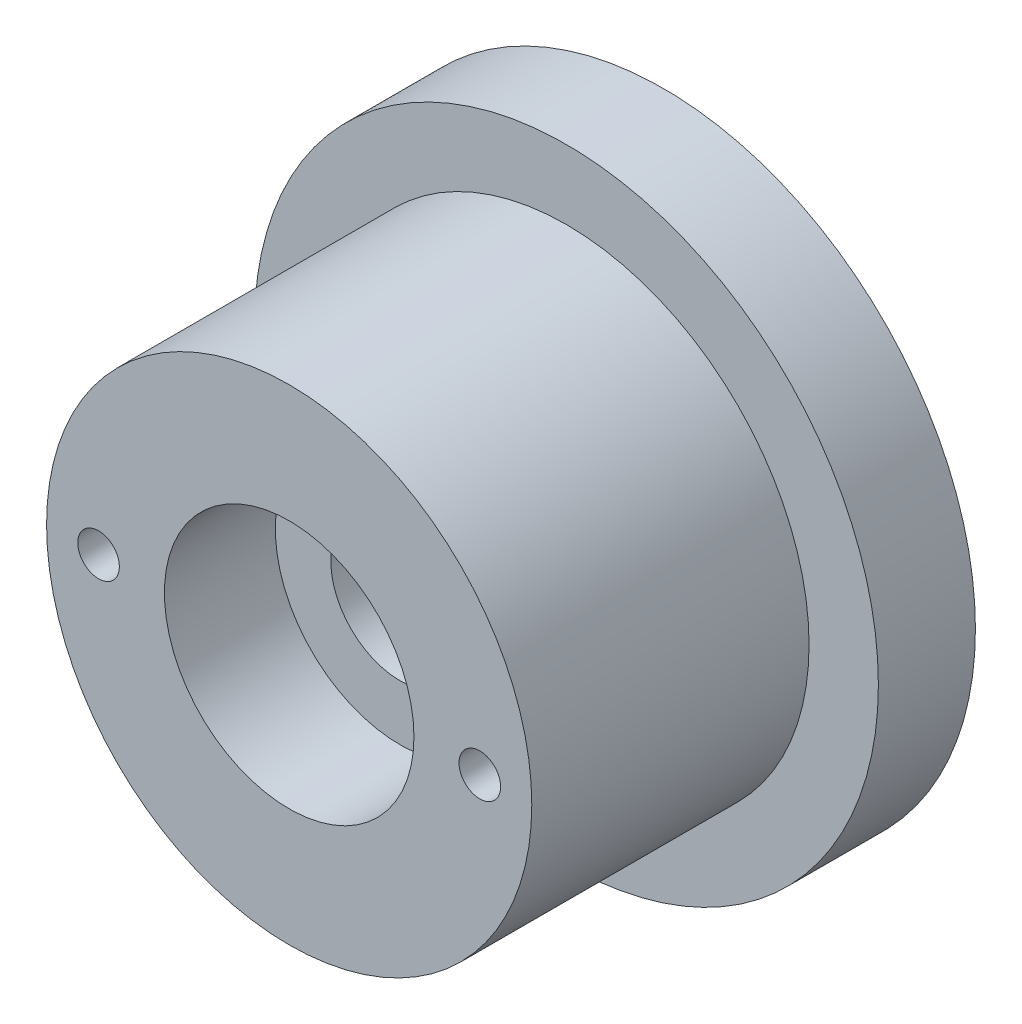
ISO-10303-21;
HEADER;
FILE_DESCRIPTION(('STEP AP214'),'2;1');
FILE_NAME('part.step','',(''),(''),'','','');
FILE_SCHEMA(('AUTOMOTIVE_DESIGN { 1 0 10303 214 1 1 1 1 }'));
ENDSEC;
DATA;
#1=APPLICATION_CONTEXT('core data for automotive mechanical design processes');
#2=APPLICATION_PROTOCOL_DEFINITION('international standard','automotive_design',2000,#1);
#3=PRODUCT_CONTEXT('',#1,'mechanical');
#4=PRODUCT('Part','Part','',(#3));
#5=PRODUCT_RELATED_PRODUCT_CATEGORY('part','',(#4));
#6=PRODUCT_DEFINITION_FORMATION('','',#4);
#7=PRODUCT_DEFINITION_CONTEXT('part definition',#1,'design');
#8=PRODUCT_DEFINITION('design','',#6,#7);
#9=PRODUCT_DEFINITION_SHAPE('','',#8);
#10=(LENGTH_UNIT() NAMED_UNIT(*) SI_UNIT(.MILLI.,.METRE.));
#11=(NAMED_UNIT(*) PLANE_ANGLE_UNIT() SI_UNIT($,.RADIAN.));
#12=(NAMED_UNIT(*) SI_UNIT($,.STERADIAN.) SOLID_ANGLE_UNIT());
#13=UNCERTAINTY_MEASURE_WITH_UNIT(LENGTH_MEASURE(1.E-05),#10,'distance_accuracy_value','');
#14=(GEOMETRIC_REPRESENTATION_CONTEXT(3) GLOBAL_UNCERTAINTY_ASSIGNED_CONTEXT((#13)) GLOBAL_UNIT_ASSIGNED_CONTEXT((#10,
#11,#12)) REPRESENTATION_CONTEXT('',''));
#15=CARTESIAN_POINT('',(0.,0.,0.));
#16=DIRECTION('',(0.,0.,1.));
#17=DIRECTION('',(1.,0.,0.));
#18=AXIS2_PLACEMENT_3D('',#15,#16,#17);
#19=CARTESIAN_POINT('',(0.,0.,13.5));
#20=DIRECTION('',(0.,0.,-1.));
#21=DIRECTION('',(-1.,0.,0.));
#22=AXIS2_PLACEMENT_3D('',#19,#20,#21);
#23=CYLINDRICAL_SURFACE('',#22,5.);
#24=CARTESIAN_POINT('',(0.,0.,-13.5));
#25=DIRECTION('',(0.,0.,1.));
#26=DIRECTION('',(1.,0.,0.));
#27=AXIS2_PLACEMENT_3D('',#24,#25,#26);
#28=CIRCLE('',#27,5.);
#29=CARTESIAN_POINT('',(5.,0.,-13.5));
#30=VERTEX_POINT('',#29);
#31=EDGE_CURVE('E54',#30,#30,#28,.T.);
#32=ORIENTED_EDGE('',*,*,#31,.F.);
#33=EDGE_LOOP('',(#32));
#34=FACE_BOUND('',#33,.T.);
#35=CARTESIAN_POINT('',(0.,0.,5.5));
#36=DIRECTION('',(0.,0.,1.));
#37=DIRECTION('',(1.,0.,0.));
#38=AXIS2_PLACEMENT_3D('',#35,#36,#37);
#39=CIRCLE('',#38,5.);
#40=CARTESIAN_POINT('',(5.,0.,5.5));
#41=VERTEX_POINT('',#40);
#42=EDGE_CURVE('E44',#41,#41,#39,.T.);
#43=ORIENTED_EDGE('',*,*,#42,.T.);
#44=EDGE_LOOP('',(#43));
#45=FACE_BOUND('',#44,.T.);
#46=ADVANCED_FACE('F40',(#34,#45),#23,.F.);
#47=CARTESIAN_POINT('',(0.,0.,13.5));
#48=DIRECTION('',(0.,0.,-1.));
#49=DIRECTION('',(-1.,0.,0.));
#50=AXIS2_PLACEMENT_3D('',#47,#48,#49);
#51=CYLINDRICAL_SURFACE('',#50,17.5);
#52=CARTESIAN_POINT('',(0.,0.,13.5));
#53=DIRECTION('',(0.,0.,1.));
#54=DIRECTION('',(1.,0.,0.));
#55=AXIS2_PLACEMENT_3D('',#52,#53,#54);
#56=CIRCLE('',#55,17.5);
#57=CARTESIAN_POINT('',(17.5,0.,13.5));
#58=VERTEX_POINT('',#57);
#59=EDGE_CURVE('E49',#58,#58,#56,.T.);
#60=ORIENTED_EDGE('',*,*,#59,.F.);
#61=EDGE_LOOP('',(#60));
#62=FACE_BOUND('',#61,.T.);
#63=CARTESIAN_POINT('',(0.,0.,-6.5));
#64=DIRECTION('',(0.,0.,-1.));
#65=DIRECTION('',(-1.,0.,0.));
#66=AXIS2_PLACEMENT_3D('',#63,#64,#65);
#67=CIRCLE('',#66,17.5);
#68=CARTESIAN_POINT('',(-17.5,0.,-6.5));
#69=VERTEX_POINT('',#68);
#70=EDGE_CURVE('E10',#69,#69,#67,.T.);
#71=ORIENTED_EDGE('',*,*,#70,.F.);
#72=EDGE_LOOP('',(#71));
#73=FACE_BOUND('',#72,.T.);
#74=ADVANCED_FACE('F42',(#62,#73),#51,.T.);
#75=CARTESIAN_POINT('',(0.,0.,13.5));
#76=DIRECTION('',(0.,0.,1.));
#77=DIRECTION('',(1.,0.,0.));
#78=AXIS2_PLACEMENT_3D('',#75,#76,#77);
#79=PLANE('',#78);
#80=CARTESIAN_POINT('',(0.,0.,13.5));
#81=DIRECTION('',(0.,0.,1.));
#82=DIRECTION('',(1.,0.,0.));
#83=AXIS2_PLACEMENT_3D('',#80,#81,#82);
#84=CIRCLE('',#83,9.);
#85=CARTESIAN_POINT('',(9.,0.,13.5));
#86=VERTEX_POINT('',#85);
#87=EDGE_CURVE('E84',#86,#86,#84,.T.);
#88=ORIENTED_EDGE('',*,*,#87,.F.);
#89=EDGE_LOOP('',(#88));
#90=FACE_BOUND('',#89,.T.);
#91=CARTESIAN_POINT('',(-13.75,0.,13.5));
#92=DIRECTION('',(0.,0.,1.));
#93=DIRECTION('',(1.,0.,0.));
#94=AXIS2_PLACEMENT_3D('',#91,#92,#93);
#95=CIRCLE('',#94,1.5);
#96=CARTESIAN_POINT('',(-12.25,0.,13.5));
#97=VERTEX_POINT('',#96);
#98=EDGE_CURVE('E60',#97,#97,#95,.T.);
#99=ORIENTED_EDGE('',*,*,#98,.F.);
#100=EDGE_LOOP('',(#99));
#101=FACE_BOUND('',#100,.T.);
#102=ORIENTED_EDGE('',*,*,#59,.T.);
#103=EDGE_LOOP('',(#102));
#104=FACE_BOUND('',#103,.T.);
#105=CARTESIAN_POINT('',(13.75,0.,13.5));
#106=DIRECTION('',(0.,0.,1.));
#107=DIRECTION('',(1.,0.,0.));
#108=AXIS2_PLACEMENT_3D('',#105,#106,#107);
#109=CIRCLE('',#108,1.5);
#110=CARTESIAN_POINT('',(15.25,0.,13.5));
#111=VERTEX_POINT('',#110);
#112=EDGE_CURVE('E65',#111,#111,#109,.T.);
#113=ORIENTED_EDGE('',*,*,#112,.F.);
#114=EDGE_LOOP('',(#113));
#115=FACE_BOUND('',#114,.T.);
#116=ADVANCED_FACE('F114',(#90,#101,#104,#115),#79,.T.);
#117=CARTESIAN_POINT('',(0.,0.,-13.5));
#118=DIRECTION('',(0.,0.,1.));
#119=DIRECTION('',(1.,0.,0.));
#120=AXIS2_PLACEMENT_3D('',#117,#118,#119);
#121=PLANE('',#120);
#122=ORIENTED_EDGE('',*,*,#31,.T.);
#123=EDGE_LOOP('',(#122));
#124=FACE_BOUND('',#123,.T.);
#125=CARTESIAN_POINT('',(-13.75,0.,-13.5));
#126=DIRECTION('',(0.,0.,1.));
#127=DIRECTION('',(1.,0.,0.));
#128=AXIS2_PLACEMENT_3D('',#125,#126,#127);
#129=CIRCLE('',#128,1.5);
#130=CARTESIAN_POINT('',(-12.25,0.,-13.5));
#131=VERTEX_POINT('',#130);
#132=EDGE_CURVE('E61',#131,#131,#129,.T.);
#133=ORIENTED_EDGE('',*,*,#132,.T.);
#134=EDGE_LOOP('',(#133));
#135=FACE_BOUND('',#134,.T.);
#136=CARTESIAN_POINT('',(13.75,0.,-13.5));
#137=DIRECTION('',(0.,0.,1.));
#138=DIRECTION('',(1.,0.,0.));
#139=AXIS2_PLACEMENT_3D('',#136,#137,#138);
#140=CIRCLE('',#139,1.5);
#141=CARTESIAN_POINT('',(15.25,0.,-13.5));
#142=VERTEX_POINT('',#141);
#143=EDGE_CURVE('E69',#142,#142,#140,.T.);
#144=ORIENTED_EDGE('',*,*,#143,.T.);
#145=EDGE_LOOP('',(#144));
#146=FACE_BOUND('',#145,.T.);
#147=CARTESIAN_POINT('',(0.,0.,-13.5));
#148=DIRECTION('',(0.,0.,-1.));
#149=DIRECTION('',(-1.,0.,0.));
#150=AXIS2_PLACEMENT_3D('',#147,#148,#149);
#151=CIRCLE('',#150,22.5);
#152=CARTESIAN_POINT('',(-22.5,0.,-13.5));
#153=VERTEX_POINT('',#152);
#154=EDGE_CURVE('E77',#153,#153,#151,.T.);
#155=ORIENTED_EDGE('',*,*,#154,.T.);
#156=EDGE_LOOP('',(#155));
#157=FACE_BOUND('',#156,.T.);
#158=ADVANCED_FACE('F122',(#124,#135,#146,#157),#121,.F.);
#159=CARTESIAN_POINT('',(-13.75,0.,13.5));
#160=DIRECTION('',(0.,0.,-1.));
#161=DIRECTION('',(-1.,0.,0.));
#162=AXIS2_PLACEMENT_3D('',#159,#160,#161);
#163=CYLINDRICAL_SURFACE('',#162,1.5);
#164=ORIENTED_EDGE('',*,*,#98,.T.);
#165=EDGE_LOOP('',(#164));
#166=FACE_BOUND('',#165,.T.);
#167=ORIENTED_EDGE('',*,*,#132,.F.);
#168=EDGE_LOOP('',(#167));
#169=FACE_BOUND('',#168,.T.);
#170=ADVANCED_FACE('F119',(#166,#169),#163,.F.);
#171=CARTESIAN_POINT('',(13.75,0.,13.5));
#172=DIRECTION('',(0.,0.,-1.));
#173=DIRECTION('',(-1.,0.,0.));
#174=AXIS2_PLACEMENT_3D('',#171,#172,#173);
#175=CYLINDRICAL_SURFACE('',#174,1.5);
#176=ORIENTED_EDGE('',*,*,#112,.T.);
#177=EDGE_LOOP('',(#176));
#178=FACE_BOUND('',#177,.T.);
#179=ORIENTED_EDGE('',*,*,#143,.F.);
#180=EDGE_LOOP('',(#179));
#181=FACE_BOUND('',#180,.T.);
#182=ADVANCED_FACE('F129',(#178,#181),#175,.F.);
#183=CARTESIAN_POINT('',(0.,0.,-6.5));
#184=DIRECTION('',(0.,0.,-1.));
#185=DIRECTION('',(-1.,0.,0.));
#186=AXIS2_PLACEMENT_3D('',#183,#184,#185);
#187=CYLINDRICAL_SURFACE('',#186,22.5);
#188=CARTESIAN_POINT('',(0.,0.,-6.5));
#189=DIRECTION('',(0.,0.,-1.));
#190=DIRECTION('',(-1.,0.,0.));
#191=AXIS2_PLACEMENT_3D('',#188,#189,#190);
#192=CIRCLE('',#191,22.5);
#193=CARTESIAN_POINT('',(-22.5,0.,-6.5));
#194=VERTEX_POINT('',#193);
#195=EDGE_CURVE('E73',#194,#194,#192,.T.);
#196=ORIENTED_EDGE('',*,*,#195,.T.);
#197=EDGE_LOOP('',(#196));
#198=FACE_BOUND('',#197,.T.);
#199=ORIENTED_EDGE('',*,*,#154,.F.);
#200=EDGE_LOOP('',(#199));
#201=FACE_BOUND('',#200,.T.);
#202=ADVANCED_FACE('F138',(#198,#201),#187,.T.);
#203=CARTESIAN_POINT('',(0.,0.,-6.5));
#204=DIRECTION('',(0.,0.,-1.));
#205=DIRECTION('',(-1.,0.,0.));
#206=AXIS2_PLACEMENT_3D('',#203,#204,#205);
#207=PLANE('',#206);
#208=ORIENTED_EDGE('',*,*,#70,.T.);
#209=EDGE_LOOP('',(#208));
#210=FACE_BOUND('',#209,.T.);
#211=ORIENTED_EDGE('',*,*,#195,.F.);
#212=EDGE_LOOP('',(#211));
#213=FACE_BOUND('',#212,.T.);
#214=ADVANCED_FACE('F105',(#210,#213),#207,.F.);
#215=CARTESIAN_POINT('',(0.,0.,5.5));
#216=DIRECTION('',(0.,0.,1.));
#217=DIRECTION('',(1.,0.,0.));
#218=AXIS2_PLACEMENT_3D('',#215,#216,#217);
#219=CYLINDRICAL_SURFACE('',#218,9.);
#220=CARTESIAN_POINT('',(0.,0.,5.5));
#221=DIRECTION('',(0.,0.,1.));
#222=DIRECTION('',(1.,0.,0.));
#223=AXIS2_PLACEMENT_3D('',#220,#221,#222);
#224=CIRCLE('',#223,9.);
#225=CARTESIAN_POINT('',(9.,0.,5.5));
#226=VERTEX_POINT('',#225);
#227=EDGE_CURVE('E88',#226,#226,#224,.T.);
#228=ORIENTED_EDGE('',*,*,#227,.F.);
#229=EDGE_LOOP('',(#228));
#230=FACE_BOUND('',#229,.T.);
#231=ORIENTED_EDGE('',*,*,#87,.T.);
#232=EDGE_LOOP('',(#231));
#233=FACE_BOUND('',#232,.T.);
#234=ADVANCED_FACE('F100',(#230,#233),#219,.F.);
#235=CARTESIAN_POINT('',(0.,0.,5.5));
#236=DIRECTION('',(0.,0.,1.));
#237=DIRECTION('',(1.,0.,0.));
#238=AXIS2_PLACEMENT_3D('',#235,#236,#237);
#239=PLANE('',#238);
#240=ORIENTED_EDGE('',*,*,#42,.F.);
#241=EDGE_LOOP('',(#240));
#242=FACE_BOUND('',#241,.T.);
#243=ORIENTED_EDGE('',*,*,#227,.T.);
#244=EDGE_LOOP('',(#243));
#245=FACE_BOUND('',#244,.T.);
#246=ADVANCED_FACE('F98',(#242,#245),#239,.T.);
#247=CLOSED_SHELL('',(#46,#74,#116,#158,#170,#182,#202,#214,#234,#246));
#248=MANIFOLD_SOLID_BREP('B2',#247);
#249=ADVANCED_BREP_SHAPE_REPRESENTATION('',(#18,#248),#14);
#250=SHAPE_DEFINITION_REPRESENTATION(#9,#249);
ENDSEC;
END-ISO-10303-21;
